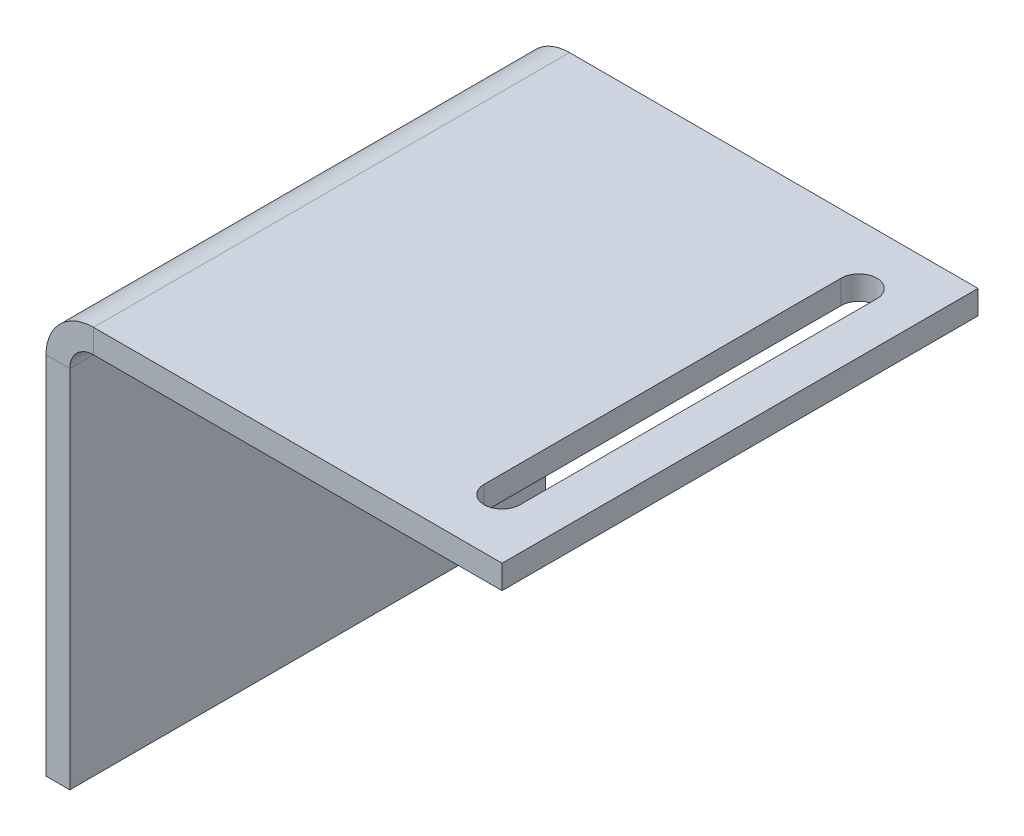
ISO-10303-21;
HEADER;
FILE_DESCRIPTION(('STEP AP214'),'2;1');
FILE_NAME('part.step','',(''),(''),'','','');
FILE_SCHEMA(('AUTOMOTIVE_DESIGN { 1 0 10303 214 1 1 1 1 }'));
ENDSEC;
DATA;
#1=APPLICATION_CONTEXT('core data for automotive mechanical design processes');
#2=APPLICATION_PROTOCOL_DEFINITION('international standard','automotive_design',2000,#1);
#3=PRODUCT_CONTEXT('',#1,'mechanical');
#4=PRODUCT('Part','Part','',(#3));
#5=PRODUCT_RELATED_PRODUCT_CATEGORY('part','',(#4));
#6=PRODUCT_DEFINITION_FORMATION('','',#4);
#7=PRODUCT_DEFINITION_CONTEXT('part definition',#1,'design');
#8=PRODUCT_DEFINITION('design','',#6,#7);
#9=PRODUCT_DEFINITION_SHAPE('','',#8);
#10=(LENGTH_UNIT() NAMED_UNIT(*) SI_UNIT(.MILLI.,.METRE.));
#11=(NAMED_UNIT(*) PLANE_ANGLE_UNIT() SI_UNIT($,.RADIAN.));
#12=(NAMED_UNIT(*) SI_UNIT($,.STERADIAN.) SOLID_ANGLE_UNIT());
#13=UNCERTAINTY_MEASURE_WITH_UNIT(LENGTH_MEASURE(1.E-05),#10,'distance_accuracy_value','');
#14=(GEOMETRIC_REPRESENTATION_CONTEXT(3) GLOBAL_UNCERTAINTY_ASSIGNED_CONTEXT((#13)) GLOBAL_UNIT_ASSIGNED_CONTEXT((#10,
#11,#12)) REPRESENTATION_CONTEXT('',''));
#15=CARTESIAN_POINT('',(0.,0.,0.));
#16=DIRECTION('',(0.,0.,1.));
#17=DIRECTION('',(1.,0.,0.));
#18=AXIS2_PLACEMENT_3D('',#15,#16,#17);
#19=CARTESIAN_POINT('',(-57.5,-6.,-60.));
#20=DIRECTION('',(0.,0.,-1.));
#21=DIRECTION('',(-1.,0.,0.));
#22=AXIS2_PLACEMENT_3D('',#19,#20,#21);
#23=PLANE('',#22);
#24=DIRECTION('',(-1.,0.,0.));
#25=VECTOR('',#24,1.);
#26=CARTESIAN_POINT('',(-57.5,-6.,-60.));
#27=LINE('',#26,#25);
#28=CARTESIAN_POINT('',(57.5,-6.,-60.));
#29=VERTEX_POINT('',#28);
#30=CARTESIAN_POINT('',(-45.5,-6.,-60.));
#31=VERTEX_POINT('',#30);
#32=EDGE_CURVE('E197',#29,#31,#27,.T.);
#33=ORIENTED_EDGE('',*,*,#32,.T.);
#34=DIRECTION('',(0.,1.,0.));
#35=VECTOR('',#34,1.);
#36=CARTESIAN_POINT('',(-45.5,-6.,-60.));
#37=LINE('',#36,#35);
#38=CARTESIAN_POINT('',(-45.5,0.,-60.));
#39=VERTEX_POINT('',#38);
#40=EDGE_CURVE('E178',#31,#39,#37,.T.);
#41=ORIENTED_EDGE('',*,*,#40,.T.);
#42=DIRECTION('',(-1.,0.,0.));
#43=VECTOR('',#42,1.);
#44=CARTESIAN_POINT('',(-57.5,0.,-60.));
#45=LINE('',#44,#43);
#46=CARTESIAN_POINT('',(57.5,0.,-60.));
#47=VERTEX_POINT('',#46);
#48=EDGE_CURVE('E205',#47,#39,#45,.T.);
#49=ORIENTED_EDGE('',*,*,#48,.F.);
#50=DIRECTION('',(0.,1.,0.));
#51=VECTOR('',#50,1.);
#52=CARTESIAN_POINT('',(57.5,-6.,-60.));
#53=LINE('',#52,#51);
#54=EDGE_CURVE('E21',#29,#47,#53,.T.);
#55=ORIENTED_EDGE('',*,*,#54,.F.);
#56=EDGE_LOOP('',(#33,#41,#49,#55));
#57=FACE_BOUND('',#56,.T.);
#58=ADVANCED_FACE('F17',(#57),#23,.T.);
#59=CARTESIAN_POINT('',(0.,-6.,0.));
#60=DIRECTION('',(0.,-1.,0.));
#61=DIRECTION('',(0.,0.,-1.));
#62=AXIS2_PLACEMENT_3D('',#59,#60,#61);
#63=PLANE('',#62);
#64=CARTESIAN_POINT('',(42.5,-6.,45.));
#65=DIRECTION('',(0.,-1.,0.));
#66=DIRECTION('',(0.,0.,-1.));
#67=AXIS2_PLACEMENT_3D('',#64,#65,#66);
#68=CIRCLE('',#67,4.5);
#69=CARTESIAN_POINT('',(47.,-6.,45.));
#70=VERTEX_POINT('',#69);
#71=CARTESIAN_POINT('',(38.,-6.,45.));
#72=VERTEX_POINT('',#71);
#73=EDGE_CURVE('E139',#70,#72,#68,.T.);
#74=ORIENTED_EDGE('',*,*,#73,.F.);
#75=DIRECTION('',(0.,0.,1.));
#76=VECTOR('',#75,1.);
#77=CARTESIAN_POINT('',(47.,-6.,0.));
#78=LINE('',#77,#76);
#79=CARTESIAN_POINT('',(47.,-6.,-45.));
#80=VERTEX_POINT('',#79);
#81=EDGE_CURVE('E132',#80,#70,#78,.T.);
#82=ORIENTED_EDGE('',*,*,#81,.F.);
#83=CARTESIAN_POINT('',(42.5,-6.,-45.));
#84=DIRECTION('',(0.,-1.,0.));
#85=DIRECTION('',(0.,0.,-1.));
#86=AXIS2_PLACEMENT_3D('',#83,#84,#85);
#87=CIRCLE('',#86,4.5);
#88=CARTESIAN_POINT('',(38.,-6.,-45.));
#89=VERTEX_POINT('',#88);
#90=EDGE_CURVE('E112',#89,#80,#87,.T.);
#91=ORIENTED_EDGE('',*,*,#90,.F.);
#92=DIRECTION('',(0.,0.,-1.));
#93=VECTOR('',#92,1.);
#94=CARTESIAN_POINT('',(38.,-6.,0.));
#95=LINE('',#94,#93);
#96=EDGE_CURVE('E137',#72,#89,#95,.T.);
#97=ORIENTED_EDGE('',*,*,#96,.F.);
#98=EDGE_LOOP('',(#74,#82,#91,#97));
#99=FACE_BOUND('',#98,.T.);
#100=DIRECTION('',(1.,0.,0.));
#101=VECTOR('',#100,1.);
#102=CARTESIAN_POINT('',(-57.5,-6.,60.));
#103=LINE('',#102,#101);
#104=CARTESIAN_POINT('',(-45.5,-6.,60.));
#105=VERTEX_POINT('',#104);
#106=CARTESIAN_POINT('',(57.5,-6.,60.));
#107=VERTEX_POINT('',#106);
#108=EDGE_CURVE('E201',#105,#107,#103,.T.);
#109=ORIENTED_EDGE('',*,*,#108,.F.);
#110=DIRECTION('',(0.,0.,-1.));
#111=VECTOR('',#110,1.);
#112=CARTESIAN_POINT('',(-45.5,-6.,-60.));
#113=LINE('',#112,#111);
#114=EDGE_CURVE('E184',#31,#105,#113,.F.);
#115=ORIENTED_EDGE('',*,*,#114,.F.);
#116=ORIENTED_EDGE('',*,*,#32,.F.);
#117=DIRECTION('',(0.,0.,-1.));
#118=VECTOR('',#117,1.);
#119=CARTESIAN_POINT('',(57.5,-6.,60.));
#120=LINE('',#119,#118);
#121=EDGE_CURVE('E194',#107,#29,#120,.T.);
#122=ORIENTED_EDGE('',*,*,#121,.F.);
#123=EDGE_LOOP('',(#109,#115,#116,#122));
#124=FACE_BOUND('',#123,.T.);
#125=ADVANCED_FACE('F266',(#99,#124),#63,.T.);
#126=CARTESIAN_POINT('',(0.,0.,0.));
#127=DIRECTION('',(0.,-1.,0.));
#128=DIRECTION('',(0.,0.,-1.));
#129=AXIS2_PLACEMENT_3D('',#126,#127,#128);
#130=PLANE('',#129);
#131=DIRECTION('',(0.,0.,-1.));
#132=VECTOR('',#131,1.);
#133=CARTESIAN_POINT('',(47.,0.,45.));
#134=LINE('',#133,#132);
#135=CARTESIAN_POINT('',(47.,0.,45.));
#136=VERTEX_POINT('',#135);
#137=CARTESIAN_POINT('',(47.,0.,-45.));
#138=VERTEX_POINT('',#137);
#139=EDGE_CURVE('E118',#136,#138,#134,.T.);
#140=ORIENTED_EDGE('',*,*,#139,.F.);
#141=CARTESIAN_POINT('',(42.5,0.,45.));
#142=DIRECTION('',(0.,1.,0.));
#143=DIRECTION('',(0.,0.,1.));
#144=AXIS2_PLACEMENT_3D('',#141,#142,#143);
#145=CIRCLE('',#144,4.5);
#146=CARTESIAN_POINT('',(38.,0.,45.));
#147=VERTEX_POINT('',#146);
#148=EDGE_CURVE('E40',#147,#136,#145,.T.);
#149=ORIENTED_EDGE('',*,*,#148,.F.);
#150=DIRECTION('',(0.,0.,1.));
#151=VECTOR('',#150,1.);
#152=CARTESIAN_POINT('',(38.,0.,45.));
#153=LINE('',#152,#151);
#154=CARTESIAN_POINT('',(38.,0.,-45.));
#155=VERTEX_POINT('',#154);
#156=EDGE_CURVE('E125',#155,#147,#153,.T.);
#157=ORIENTED_EDGE('',*,*,#156,.F.);
#158=CARTESIAN_POINT('',(42.5,0.,-45.));
#159=DIRECTION('',(0.,1.,0.));
#160=DIRECTION('',(0.,0.,1.));
#161=AXIS2_PLACEMENT_3D('',#158,#159,#160);
#162=CIRCLE('',#161,4.5);
#163=EDGE_CURVE('E109',#138,#155,#162,.T.);
#164=ORIENTED_EDGE('',*,*,#163,.F.);
#165=EDGE_LOOP('',(#140,#149,#157,#164));
#166=FACE_BOUND('',#165,.T.);
#167=DIRECTION('',(0.,0.,-1.));
#168=VECTOR('',#167,1.);
#169=CARTESIAN_POINT('',(-45.5,0.,-60.));
#170=LINE('',#169,#168);
#171=CARTESIAN_POINT('',(-45.5,0.,60.));
#172=VERTEX_POINT('',#171);
#173=EDGE_CURVE('E172',#39,#172,#170,.F.);
#174=ORIENTED_EDGE('',*,*,#173,.T.);
#175=DIRECTION('',(1.,0.,0.));
#176=VECTOR('',#175,1.);
#177=CARTESIAN_POINT('',(-57.5,0.,60.));
#178=LINE('',#177,#176);
#179=CARTESIAN_POINT('',(57.5,0.,60.));
#180=VERTEX_POINT('',#179);
#181=EDGE_CURVE('E198',#172,#180,#178,.T.);
#182=ORIENTED_EDGE('',*,*,#181,.T.);
#183=DIRECTION('',(0.,0.,-1.));
#184=VECTOR('',#183,1.);
#185=CARTESIAN_POINT('',(57.5,0.,60.));
#186=LINE('',#185,#184);
#187=EDGE_CURVE('E192',#180,#47,#186,.T.);
#188=ORIENTED_EDGE('',*,*,#187,.T.);
#189=ORIENTED_EDGE('',*,*,#48,.T.);
#190=EDGE_LOOP('',(#174,#182,#188,#189));
#191=FACE_BOUND('',#190,.T.);
#192=ADVANCED_FACE('F122',(#166,#191),#130,.F.);
#193=CARTESIAN_POINT('',(57.5,-6.,60.));
#194=DIRECTION('',(1.,0.,0.));
#195=DIRECTION('',(0.,0.,-1.));
#196=AXIS2_PLACEMENT_3D('',#193,#194,#195);
#197=PLANE('',#196);
#198=ORIENTED_EDGE('',*,*,#187,.F.);
#199=DIRECTION('',(0.,1.,0.));
#200=VECTOR('',#199,1.);
#201=CARTESIAN_POINT('',(57.5,-6.,60.));
#202=LINE('',#201,#200);
#203=EDGE_CURVE('E11',#107,#180,#202,.T.);
#204=ORIENTED_EDGE('',*,*,#203,.F.);
#205=ORIENTED_EDGE('',*,*,#121,.T.);
#206=ORIENTED_EDGE('',*,*,#54,.T.);
#207=EDGE_LOOP('',(#198,#204,#205,#206));
#208=FACE_BOUND('',#207,.T.);
#209=ADVANCED_FACE('F19',(#208),#197,.T.);
#210=CARTESIAN_POINT('',(-57.5,-6.,60.));
#211=DIRECTION('',(0.,0.,1.));
#212=DIRECTION('',(1.,0.,0.));
#213=AXIS2_PLACEMENT_3D('',#210,#211,#212);
#214=PLANE('',#213);
#215=DIRECTION('',(0.,1.,0.));
#216=VECTOR('',#215,1.);
#217=CARTESIAN_POINT('',(-45.5,-6.,60.));
#218=LINE('',#217,#216);
#219=EDGE_CURVE('E189',#105,#172,#218,.T.);
#220=ORIENTED_EDGE('',*,*,#219,.F.);
#221=ORIENTED_EDGE('',*,*,#108,.T.);
#222=ORIENTED_EDGE('',*,*,#203,.T.);
#223=ORIENTED_EDGE('',*,*,#181,.F.);
#224=EDGE_LOOP('',(#220,#221,#222,#223));
#225=FACE_BOUND('',#224,.T.);
#226=ADVANCED_FACE('F213',(#225),#214,.T.);
#227=CARTESIAN_POINT('',(-45.5,-12.,60.));
#228=DIRECTION('',(0.,0.,1.));
#229=DIRECTION('',(1.,0.,0.));
#230=AXIS2_PLACEMENT_3D('',#227,#228,#229);
#231=PLANE('',#230);
#232=DIRECTION('',(1.,0.,0.));
#233=VECTOR('',#232,1.);
#234=CARTESIAN_POINT('',(-57.5,-12.,60.));
#235=LINE('',#234,#233);
#236=CARTESIAN_POINT('',(-51.5,-12.,60.));
#237=VERTEX_POINT('',#236);
#238=CARTESIAN_POINT('',(-57.5,-12.,60.));
#239=VERTEX_POINT('',#238);
#240=EDGE_CURVE('E141',#237,#239,#235,.F.);
#241=ORIENTED_EDGE('',*,*,#240,.F.);
#242=CARTESIAN_POINT('',(-45.5,-12.,60.));
#243=DIRECTION('',(0.,0.,-1.));
#244=DIRECTION('',(-1.,0.,0.));
#245=AXIS2_PLACEMENT_3D('',#242,#243,#244);
#246=CIRCLE('',#245,6.);
#247=EDGE_CURVE('E181',#105,#237,#246,.F.);
#248=ORIENTED_EDGE('',*,*,#247,.F.);
#249=ORIENTED_EDGE('',*,*,#219,.T.);
#250=CARTESIAN_POINT('',(-45.5,-12.,60.));
#251=DIRECTION('',(0.,0.,-1.));
#252=DIRECTION('',(-1.,0.,0.));
#253=AXIS2_PLACEMENT_3D('',#250,#251,#252);
#254=CIRCLE('',#253,12.);
#255=EDGE_CURVE('E174',#172,#239,#254,.F.);
#256=ORIENTED_EDGE('',*,*,#255,.T.);
#257=EDGE_LOOP('',(#241,#248,#249,#256));
#258=FACE_BOUND('',#257,.T.);
#259=ADVANCED_FACE('F247',(#258),#231,.T.);
#260=CARTESIAN_POINT('',(-45.5,-12.,-60.));
#261=DIRECTION('',(0.,0.,1.));
#262=DIRECTION('',(1.,0.,0.));
#263=AXIS2_PLACEMENT_3D('',#260,#261,#262);
#264=PLANE('',#263);
#265=CARTESIAN_POINT('',(-45.5,-12.,-60.));
#266=DIRECTION('',(0.,0.,-1.));
#267=DIRECTION('',(-1.,0.,0.));
#268=AXIS2_PLACEMENT_3D('',#265,#266,#267);
#269=CIRCLE('',#268,6.);
#270=CARTESIAN_POINT('',(-51.5,-12.,-60.));
#271=VERTEX_POINT('',#270);
#272=EDGE_CURVE('E145',#271,#31,#269,.T.);
#273=ORIENTED_EDGE('',*,*,#272,.F.);
#274=DIRECTION('',(1.,0.,0.));
#275=VECTOR('',#274,1.);
#276=CARTESIAN_POINT('',(-51.5,-12.,-60.));
#277=LINE('',#276,#275);
#278=CARTESIAN_POINT('',(-57.5,-12.,-60.));
#279=VERTEX_POINT('',#278);
#280=EDGE_CURVE('E165',#271,#279,#277,.F.);
#281=ORIENTED_EDGE('',*,*,#280,.T.);
#282=CARTESIAN_POINT('',(-45.5,-12.,-60.));
#283=DIRECTION('',(0.,0.,-1.));
#284=DIRECTION('',(-1.,0.,0.));
#285=AXIS2_PLACEMENT_3D('',#282,#283,#284);
#286=CIRCLE('',#285,12.);
#287=EDGE_CURVE('E175',#279,#39,#286,.T.);
#288=ORIENTED_EDGE('',*,*,#287,.T.);
#289=ORIENTED_EDGE('',*,*,#40,.F.);
#290=EDGE_LOOP('',(#273,#281,#288,#289));
#291=FACE_BOUND('',#290,.T.);
#292=ADVANCED_FACE('F226',(#291),#264,.F.);
#293=CARTESIAN_POINT('',(-45.5,-12.,-60.));
#294=DIRECTION('',(0.,0.,-1.));
#295=DIRECTION('',(-1.,0.,0.));
#296=AXIS2_PLACEMENT_3D('',#293,#294,#295);
#297=CYLINDRICAL_SURFACE('',#296,12.);
#298=ORIENTED_EDGE('',*,*,#173,.F.);
#299=ORIENTED_EDGE('',*,*,#287,.F.);
#300=DIRECTION('',(0.,0.,-1.));
#301=VECTOR('',#300,1.);
#302=CARTESIAN_POINT('',(-57.5,-12.,60.));
#303=LINE('',#302,#301);
#304=EDGE_CURVE('E163',#279,#239,#303,.F.);
#305=ORIENTED_EDGE('',*,*,#304,.T.);
#306=ORIENTED_EDGE('',*,*,#255,.F.);
#307=EDGE_LOOP('',(#298,#299,#305,#306));
#308=FACE_BOUND('',#307,.T.);
#309=ADVANCED_FACE('F223',(#308),#297,.T.);
#310=CARTESIAN_POINT('',(-45.5,-12.,-60.));
#311=DIRECTION('',(0.,0.,-1.));
#312=DIRECTION('',(-1.,0.,0.));
#313=AXIS2_PLACEMENT_3D('',#310,#311,#312);
#314=CYLINDRICAL_SURFACE('',#313,6.);
#315=ORIENTED_EDGE('',*,*,#114,.T.);
#316=ORIENTED_EDGE('',*,*,#247,.T.);
#317=DIRECTION('',(0.,0.,-1.));
#318=VECTOR('',#317,1.);
#319=CARTESIAN_POINT('',(-51.5,-12.,60.));
#320=LINE('',#319,#318);
#321=EDGE_CURVE('E168',#237,#271,#320,.T.);
#322=ORIENTED_EDGE('',*,*,#321,.T.);
#323=ORIENTED_EDGE('',*,*,#272,.T.);
#324=EDGE_LOOP('',(#315,#316,#322,#323));
#325=FACE_BOUND('',#324,.T.);
#326=ADVANCED_FACE('F250',(#325),#314,.F.);
#327=CARTESIAN_POINT('',(-57.5,-104.,-60.));
#328=DIRECTION('',(0.,0.,1.));
#329=DIRECTION('',(0.,-1.,0.));
#330=AXIS2_PLACEMENT_3D('',#327,#328,#329);
#331=PLANE('',#330);
#332=ORIENTED_EDGE('',*,*,#280,.F.);
#333=DIRECTION('',(0.,1.,0.));
#334=VECTOR('',#333,1.);
#335=CARTESIAN_POINT('',(-51.5,-104.,-60.));
#336=LINE('',#335,#334);
#337=CARTESIAN_POINT('',(-51.5,-104.,-60.));
#338=VERTEX_POINT('',#337);
#339=EDGE_CURVE('E161',#271,#338,#336,.F.);
#340=ORIENTED_EDGE('',*,*,#339,.T.);
#341=DIRECTION('',(1.,0.,0.));
#342=VECTOR('',#341,1.);
#343=CARTESIAN_POINT('',(-57.5,-104.,-60.));
#344=LINE('',#343,#342);
#345=CARTESIAN_POINT('',(-57.5,-104.,-60.));
#346=VERTEX_POINT('',#345);
#347=EDGE_CURVE('E142',#346,#338,#344,.T.);
#348=ORIENTED_EDGE('',*,*,#347,.F.);
#349=DIRECTION('',(0.,-1.,0.));
#350=VECTOR('',#349,1.);
#351=CARTESIAN_POINT('',(-57.5,2.07697180599949E-13,-60.));
#352=LINE('',#351,#350);
#353=EDGE_CURVE('E154',#279,#346,#352,.T.);
#354=ORIENTED_EDGE('',*,*,#353,.F.);
#355=EDGE_LOOP('',(#332,#340,#348,#354));
#356=FACE_BOUND('',#355,.T.);
#357=ADVANCED_FACE('F237',(#356),#331,.F.);
#358=CARTESIAN_POINT('',(-57.5,-6.,60.));
#359=DIRECTION('',(0.,0.,-1.));
#360=DIRECTION('',(-1.,0.,0.));
#361=AXIS2_PLACEMENT_3D('',#358,#359,#360);
#362=PLANE('',#361);
#363=ORIENTED_EDGE('',*,*,#240,.T.);
#364=DIRECTION('',(0.,1.,0.));
#365=VECTOR('',#364,1.);
#366=CARTESIAN_POINT('',(-57.5,2.20442087770391E-13,60.));
#367=LINE('',#366,#365);
#368=CARTESIAN_POINT('',(-57.5,-104.,60.));
#369=VERTEX_POINT('',#368);
#370=EDGE_CURVE('E149',#369,#239,#367,.T.);
#371=ORIENTED_EDGE('',*,*,#370,.F.);
#372=DIRECTION('',(1.,0.,0.));
#373=VECTOR('',#372,1.);
#374=CARTESIAN_POINT('',(-57.5,-104.,60.));
#375=LINE('',#374,#373);
#376=CARTESIAN_POINT('',(-51.5,-104.,60.));
#377=VERTEX_POINT('',#376);
#378=EDGE_CURVE('E146',#369,#377,#375,.T.);
#379=ORIENTED_EDGE('',*,*,#378,.T.);
#380=DIRECTION('',(0.,-1.,0.));
#381=VECTOR('',#380,1.);
#382=CARTESIAN_POINT('',(-51.5,-6.,60.));
#383=LINE('',#382,#381);
#384=EDGE_CURVE('E156',#377,#237,#383,.F.);
#385=ORIENTED_EDGE('',*,*,#384,.T.);
#386=EDGE_LOOP('',(#363,#371,#379,#385));
#387=FACE_BOUND('',#386,.T.);
#388=ADVANCED_FACE('F244',(#387),#362,.F.);
#389=CARTESIAN_POINT('',(-57.5,2.20442087770391E-13,0.));
#390=DIRECTION('',(1.,0.,0.));
#391=DIRECTION('',(0.,1.,0.));
#392=AXIS2_PLACEMENT_3D('',#389,#390,#391);
#393=PLANE('',#392);
#394=ORIENTED_EDGE('',*,*,#304,.F.);
#395=ORIENTED_EDGE('',*,*,#353,.T.);
#396=DIRECTION('',(0.,0.,1.));
#397=VECTOR('',#396,1.);
#398=CARTESIAN_POINT('',(-57.5,-104.,0.));
#399=LINE('',#398,#397);
#400=EDGE_CURVE('E152',#346,#369,#399,.T.);
#401=ORIENTED_EDGE('',*,*,#400,.T.);
#402=ORIENTED_EDGE('',*,*,#370,.T.);
#403=EDGE_LOOP('',(#394,#395,#401,#402));
#404=FACE_BOUND('',#403,.T.);
#405=ADVANCED_FACE('F233',(#404),#393,.F.);
#406=CARTESIAN_POINT('',(-51.5,1.99493199737332E-13,0.));
#407=DIRECTION('',(1.,0.,0.));
#408=DIRECTION('',(0.,1.,0.));
#409=AXIS2_PLACEMENT_3D('',#406,#407,#408);
#410=PLANE('',#409);
#411=ORIENTED_EDGE('',*,*,#339,.F.);
#412=ORIENTED_EDGE('',*,*,#321,.F.);
#413=ORIENTED_EDGE('',*,*,#384,.F.);
#414=DIRECTION('',(0.,0.,-1.));
#415=VECTOR('',#414,1.);
#416=CARTESIAN_POINT('',(-51.5,-104.,60.));
#417=LINE('',#416,#415);
#418=EDGE_CURVE('E159',#338,#377,#417,.F.);
#419=ORIENTED_EDGE('',*,*,#418,.F.);
#420=EDGE_LOOP('',(#411,#412,#413,#419));
#421=FACE_BOUND('',#420,.T.);
#422=ADVANCED_FACE('F252',(#421),#410,.T.);
#423=CARTESIAN_POINT('',(-57.5,-104.,60.));
#424=DIRECTION('',(0.,1.,0.));
#425=DIRECTION('',(-1.,0.,0.));
#426=AXIS2_PLACEMENT_3D('',#423,#424,#425);
#427=PLANE('',#426);
#428=ORIENTED_EDGE('',*,*,#418,.T.);
#429=ORIENTED_EDGE('',*,*,#378,.F.);
#430=ORIENTED_EDGE('',*,*,#400,.F.);
#431=ORIENTED_EDGE('',*,*,#347,.T.);
#432=EDGE_LOOP('',(#428,#429,#430,#431));
#433=FACE_BOUND('',#432,.T.);
#434=ADVANCED_FACE('F240',(#433),#427,.F.);
#435=CARTESIAN_POINT('',(42.5,-104.,45.));
#436=DIRECTION('',(0.,1.,0.));
#437=DIRECTION('',(0.,0.,1.));
#438=AXIS2_PLACEMENT_3D('',#435,#436,#437);
#439=CYLINDRICAL_SURFACE('',#438,4.5);
#440=ORIENTED_EDGE('',*,*,#73,.T.);
#441=DIRECTION('',(0.,1.,0.));
#442=VECTOR('',#441,1.);
#443=CARTESIAN_POINT('',(38.,-104.,45.));
#444=LINE('',#443,#442);
#445=EDGE_CURVE('E130',#72,#147,#444,.T.);
#446=ORIENTED_EDGE('',*,*,#445,.T.);
#447=ORIENTED_EDGE('',*,*,#148,.T.);
#448=DIRECTION('',(0.,1.,0.));
#449=VECTOR('',#448,1.);
#450=CARTESIAN_POINT('',(47.,-104.,45.));
#451=LINE('',#450,#449);
#452=EDGE_CURVE('E115',#70,#136,#451,.T.);
#453=ORIENTED_EDGE('',*,*,#452,.F.);
#454=EDGE_LOOP('',(#440,#446,#447,#453));
#455=FACE_BOUND('',#454,.T.);
#456=ADVANCED_FACE('F261',(#455),#439,.F.);
#457=CARTESIAN_POINT('',(38.,-104.,45.));
#458=DIRECTION('',(-1.,0.,0.));
#459=DIRECTION('',(0.,0.,1.));
#460=AXIS2_PLACEMENT_3D('',#457,#458,#459);
#461=PLANE('',#460);
#462=ORIENTED_EDGE('',*,*,#96,.T.);
#463=DIRECTION('',(0.,1.,0.));
#464=VECTOR('',#463,1.);
#465=CARTESIAN_POINT('',(38.,-104.,-45.));
#466=LINE('',#465,#464);
#467=EDGE_CURVE('E114',#89,#155,#466,.T.);
#468=ORIENTED_EDGE('',*,*,#467,.T.);
#469=ORIENTED_EDGE('',*,*,#156,.T.);
#470=ORIENTED_EDGE('',*,*,#445,.F.);
#471=EDGE_LOOP('',(#462,#468,#469,#470));
#472=FACE_BOUND('',#471,.T.);
#473=ADVANCED_FACE('F322',(#472),#461,.F.);
#474=CARTESIAN_POINT('',(42.5,-104.,-45.));
#475=DIRECTION('',(0.,1.,0.));
#476=DIRECTION('',(0.,0.,1.));
#477=AXIS2_PLACEMENT_3D('',#474,#475,#476);
#478=CYLINDRICAL_SURFACE('',#477,4.5);
#479=ORIENTED_EDGE('',*,*,#90,.T.);
#480=DIRECTION('',(0.,1.,0.));
#481=VECTOR('',#480,1.);
#482=CARTESIAN_POINT('',(47.,-104.,-45.));
#483=LINE('',#482,#481);
#484=EDGE_CURVE('E32',#80,#138,#483,.T.);
#485=ORIENTED_EDGE('',*,*,#484,.T.);
#486=ORIENTED_EDGE('',*,*,#163,.T.);
#487=ORIENTED_EDGE('',*,*,#467,.F.);
#488=EDGE_LOOP('',(#479,#485,#486,#487));
#489=FACE_BOUND('',#488,.T.);
#490=ADVANCED_FACE('F106',(#489),#478,.F.);
#491=CARTESIAN_POINT('',(47.,-104.,45.));
#492=DIRECTION('',(1.,0.,0.));
#493=DIRECTION('',(0.,0.,-1.));
#494=AXIS2_PLACEMENT_3D('',#491,#492,#493);
#495=PLANE('',#494);
#496=ORIENTED_EDGE('',*,*,#81,.T.);
#497=ORIENTED_EDGE('',*,*,#452,.T.);
#498=ORIENTED_EDGE('',*,*,#139,.T.);
#499=ORIENTED_EDGE('',*,*,#484,.F.);
#500=EDGE_LOOP('',(#496,#497,#498,#499));
#501=FACE_BOUND('',#500,.T.);
#502=ADVANCED_FACE('F119',(#501),#495,.F.);
#503=CLOSED_SHELL('',(#58,#125,#192,#209,#226,#259,#292,#309,#326,#357,#388,#405,#422,#434,#456,
#473,#490,#502));
#504=MANIFOLD_SOLID_BREP('B1',#503);
#505=ADVANCED_BREP_SHAPE_REPRESENTATION('',(#18,#504),#14);
#506=SHAPE_DEFINITION_REPRESENTATION(#9,#505);
ENDSEC;
END-ISO-10303-21;
